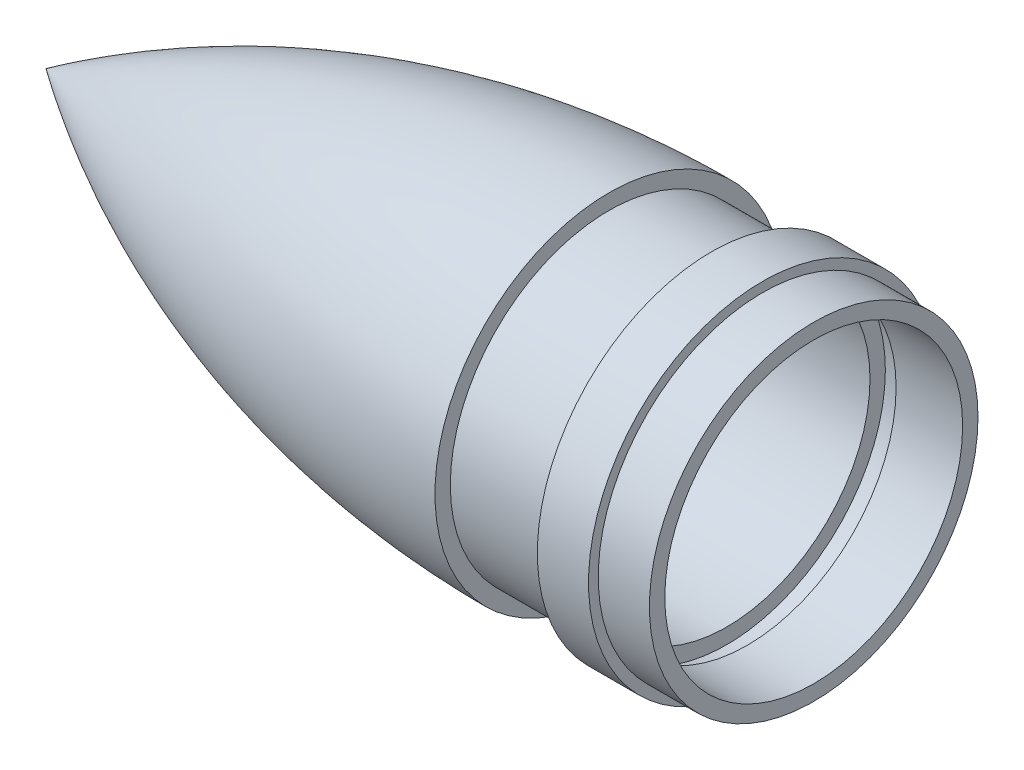
ISO-10303-21;
HEADER;
FILE_DESCRIPTION(('STEP AP214'),'2;1');
FILE_NAME('part.step','',(''),(''),'','','');
FILE_SCHEMA(('AUTOMOTIVE_DESIGN { 1 0 10303 214 1 1 1 1 }'));
ENDSEC;
DATA;
#1=APPLICATION_CONTEXT('core data for automotive mechanical design processes');
#2=APPLICATION_PROTOCOL_DEFINITION('international standard','automotive_design',2000,#1);
#3=PRODUCT_CONTEXT('',#1,'mechanical');
#4=PRODUCT('Part','Part','',(#3));
#5=PRODUCT_RELATED_PRODUCT_CATEGORY('part','',(#4));
#6=PRODUCT_DEFINITION_FORMATION('','',#4);
#7=PRODUCT_DEFINITION_CONTEXT('part definition',#1,'design');
#8=PRODUCT_DEFINITION('design','',#6,#7);
#9=PRODUCT_DEFINITION_SHAPE('','',#8);
#10=(LENGTH_UNIT() NAMED_UNIT(*) SI_UNIT(.MILLI.,.METRE.));
#11=(NAMED_UNIT(*) PLANE_ANGLE_UNIT() SI_UNIT($,.RADIAN.));
#12=(NAMED_UNIT(*) SI_UNIT($,.STERADIAN.) SOLID_ANGLE_UNIT());
#13=UNCERTAINTY_MEASURE_WITH_UNIT(LENGTH_MEASURE(1.E-05),#10,'distance_accuracy_value','');
#14=(GEOMETRIC_REPRESENTATION_CONTEXT(3) GLOBAL_UNCERTAINTY_ASSIGNED_CONTEXT((#13)) GLOBAL_UNIT_ASSIGNED_CONTEXT((#10,
#11,#12)) REPRESENTATION_CONTEXT('',''));
#15=CARTESIAN_POINT('',(0.,0.,0.));
#16=DIRECTION('',(0.,0.,1.));
#17=DIRECTION('',(1.,0.,0.));
#18=AXIS2_PLACEMENT_3D('',#15,#16,#17);
#19=CARTESIAN_POINT('',(0.,160.94,160.94));
#20=DIRECTION('',(0.,-1.,0.));
#21=DIRECTION('',(0.,0.,-1.));
#22=AXIS2_PLACEMENT_3D('',#19,#20,#21);
#23=CIRCLE('',#22,194.94);
#24=TRIMMED_CURVE('',#23,(PARAMETER_VALUE(-0.599554005573241)),
(PARAMETER_VALUE(0.599554005573241)),.T.,.PARAMETER.);
#25=CARTESIAN_POINT('',(0.,160.94,0.));
#26=DIRECTION('',(1.,0.,0.));
#27=AXIS1_PLACEMENT('',#25,#26);
#28=SURFACE_OF_REVOLUTION('',#24,#27);
#29=CARTESIAN_POINT('',(-109.999636363035,160.94,0.));
#30=VERTEX_POINT('',#29);
#31=VERTEX_LOOP('',#30);
#32=FACE_BOUND('',#31,.T.);
#33=CARTESIAN_POINT('',(0.,160.94,0.));
#34=DIRECTION('',(1.,0.,0.));
#35=DIRECTION('',(0.,0.,-1.));
#36=AXIS2_PLACEMENT_3D('',#33,#34,#35);
#37=CIRCLE('',#36,34.);
#38=CARTESIAN_POINT('',(0.,160.94,-34.));
#39=VERTEX_POINT('',#38);
#40=EDGE_CURVE('E41',#39,#39,#37,.T.);
#41=ORIENTED_EDGE('',*,*,#40,.F.);
#42=EDGE_LOOP('',(#41));
#43=FACE_BOUND('',#42,.T.);
#44=ADVANCED_FACE('F38',(#32,#43),#28,.T.);
#45=CARTESIAN_POINT('',(0.,194.94,0.));
#46=DIRECTION('',(1.,0.,0.));
#47=DIRECTION('',(0.,0.,-1.));
#48=AXIS2_PLACEMENT_3D('',#45,#46,#47);
#49=PLANE('',#48);
#50=CARTESIAN_POINT('',(0.,160.94,0.));
#51=DIRECTION('',(1.,0.,0.));
#52=DIRECTION('',(0.,0.,-1.));
#53=AXIS2_PLACEMENT_3D('',#50,#51,#52);
#54=CIRCLE('',#53,31.);
#55=CARTESIAN_POINT('',(0.,160.94,-31.));
#56=VERTEX_POINT('',#55);
#57=EDGE_CURVE('E89',#56,#56,#54,.T.);
#58=ORIENTED_EDGE('',*,*,#57,.F.);
#59=EDGE_LOOP('',(#58));
#60=FACE_BOUND('',#59,.T.);
#61=ORIENTED_EDGE('',*,*,#40,.T.);
#62=EDGE_LOOP('',(#61));
#63=FACE_BOUND('',#62,.T.);
#64=ADVANCED_FACE('F99',(#60,#63),#49,.T.);
#65=CARTESIAN_POINT('',(20.,160.94,0.));
#66=DIRECTION('',(-1.,0.,0.));
#67=DIRECTION('',(0.,0.,1.));
#68=AXIS2_PLACEMENT_3D('',#65,#66,#67);
#69=CYLINDRICAL_SURFACE('',#68,31.);
#70=CARTESIAN_POINT('',(20.,160.94,0.));
#71=DIRECTION('',(1.,0.,0.));
#72=DIRECTION('',(0.,0.,-1.));
#73=AXIS2_PLACEMENT_3D('',#70,#71,#72);
#74=CIRCLE('',#73,31.);
#75=CARTESIAN_POINT('',(20.,160.94,-31.));
#76=VERTEX_POINT('',#75);
#77=EDGE_CURVE('E92',#76,#76,#74,.T.);
#78=ORIENTED_EDGE('',*,*,#77,.F.);
#79=EDGE_LOOP('',(#78));
#80=FACE_BOUND('',#79,.T.);
#81=ORIENTED_EDGE('',*,*,#57,.T.);
#82=EDGE_LOOP('',(#81));
#83=FACE_BOUND('',#82,.T.);
#84=ADVANCED_FACE('F97',(#80,#83),#69,.T.);
#85=CARTESIAN_POINT('',(30.,160.94,0.));
#86=DIRECTION('',(-1.,0.,0.));
#87=DIRECTION('',(0.,0.,1.));
#88=AXIS2_PLACEMENT_3D('',#85,#86,#87);
#89=CYLINDRICAL_SURFACE('',#88,34.);
#90=CARTESIAN_POINT('',(30.,160.94,0.));
#91=DIRECTION('',(1.,0.,0.));
#92=DIRECTION('',(0.,0.,-1.));
#93=AXIS2_PLACEMENT_3D('',#90,#91,#92);
#94=CIRCLE('',#93,34.);
#95=CARTESIAN_POINT('',(30.,160.94,-34.));
#96=VERTEX_POINT('',#95);
#97=EDGE_CURVE('E86',#96,#96,#94,.T.);
#98=ORIENTED_EDGE('',*,*,#97,.F.);
#99=EDGE_LOOP('',(#98));
#100=FACE_BOUND('',#99,.T.);
#101=CARTESIAN_POINT('',(20.,160.94,0.));
#102=DIRECTION('',(1.,0.,0.));
#103=DIRECTION('',(0.,0.,-1.));
#104=AXIS2_PLACEMENT_3D('',#101,#102,#103);
#105=CIRCLE('',#104,34.);
#106=CARTESIAN_POINT('',(20.,160.94,-34.));
#107=VERTEX_POINT('',#106);
#108=EDGE_CURVE('E84',#107,#107,#105,.T.);
#109=ORIENTED_EDGE('',*,*,#108,.T.);
#110=EDGE_LOOP('',(#109));
#111=FACE_BOUND('',#110,.T.);
#112=ADVANCED_FACE('F118',(#100,#111),#89,.T.);
#113=CARTESIAN_POINT('',(30.,160.94,0.));
#114=DIRECTION('',(1.,0.,0.));
#115=DIRECTION('',(0.,0.,-1.));
#116=AXIS2_PLACEMENT_3D('',#113,#114,#115);
#117=PLANE('',#116);
#118=CARTESIAN_POINT('',(30.,160.94,0.));
#119=DIRECTION('',(1.,0.,0.));
#120=DIRECTION('',(0.,0.,-1.));
#121=AXIS2_PLACEMENT_3D('',#118,#119,#120);
#122=CIRCLE('',#121,32.1);
#123=CARTESIAN_POINT('',(30.,160.94,-32.1));
#124=VERTEX_POINT('',#123);
#125=EDGE_CURVE('E11',#124,#124,#122,.T.);
#126=ORIENTED_EDGE('',*,*,#125,.F.);
#127=EDGE_LOOP('',(#126));
#128=FACE_BOUND('',#127,.T.);
#129=ORIENTED_EDGE('',*,*,#97,.T.);
#130=EDGE_LOOP('',(#129));
#131=FACE_BOUND('',#130,.T.);
#132=ADVANCED_FACE('F126',(#128,#131),#117,.T.);
#133=CARTESIAN_POINT('',(20.,160.94,0.));
#134=DIRECTION('',(1.,0.,0.));
#135=DIRECTION('',(0.,0.,-1.));
#136=AXIS2_PLACEMENT_3D('',#133,#134,#135);
#137=PLANE('',#136);
#138=ORIENTED_EDGE('',*,*,#77,.T.);
#139=EDGE_LOOP('',(#138));
#140=FACE_BOUND('',#139,.T.);
#141=ORIENTED_EDGE('',*,*,#108,.F.);
#142=EDGE_LOOP('',(#141));
#143=FACE_BOUND('',#142,.T.);
#144=ADVANCED_FACE('F135',(#140,#143),#137,.F.);
#145=CARTESIAN_POINT('',(40.,160.94,0.));
#146=DIRECTION('',(-1.,0.,0.));
#147=DIRECTION('',(0.,0.,1.));
#148=AXIS2_PLACEMENT_3D('',#145,#146,#147);
#149=CYLINDRICAL_SURFACE('',#148,32.1);
#150=CARTESIAN_POINT('',(40.,160.94,0.));
#151=DIRECTION('',(1.,0.,0.));
#152=DIRECTION('',(0.,0.,-1.));
#153=AXIS2_PLACEMENT_3D('',#150,#151,#152);
#154=CIRCLE('',#153,32.1);
#155=CARTESIAN_POINT('',(40.,160.94,-32.1));
#156=VERTEX_POINT('',#155);
#157=EDGE_CURVE('E66',#156,#156,#154,.T.);
#158=ORIENTED_EDGE('',*,*,#157,.F.);
#159=EDGE_LOOP('',(#158));
#160=FACE_BOUND('',#159,.T.);
#161=ORIENTED_EDGE('',*,*,#125,.T.);
#162=EDGE_LOOP('',(#161));
#163=FACE_BOUND('',#162,.T.);
#164=ADVANCED_FACE('F143',(#160,#163),#149,.T.);
#165=CARTESIAN_POINT('',(40.,160.94,0.));
#166=DIRECTION('',(1.,0.,0.));
#167=DIRECTION('',(0.,0.,-1.));
#168=AXIS2_PLACEMENT_3D('',#165,#166,#167);
#169=PLANE('',#168);
#170=CARTESIAN_POINT('',(40.,160.94,0.));
#171=DIRECTION('',(1.,0.,0.));
#172=DIRECTION('',(0.,0.,-1.));
#173=AXIS2_PLACEMENT_3D('',#170,#171,#172);
#174=CIRCLE('',#173,29.1);
#175=CARTESIAN_POINT('',(40.,160.94,-29.1));
#176=VERTEX_POINT('',#175);
#177=EDGE_CURVE('E78',#176,#176,#174,.T.);
#178=ORIENTED_EDGE('',*,*,#177,.F.);
#179=EDGE_LOOP('',(#178));
#180=FACE_BOUND('',#179,.T.);
#181=ORIENTED_EDGE('',*,*,#157,.T.);
#182=EDGE_LOOP('',(#181));
#183=FACE_BOUND('',#182,.T.);
#184=ADVANCED_FACE('F56',(#180,#183),#169,.T.);
#185=CARTESIAN_POINT('',(0.,160.94,160.94));
#186=DIRECTION('',(0.,-1.,0.));
#187=DIRECTION('',(0.,0.,-1.));
#188=AXIS2_PLACEMENT_3D('',#185,#186,#187);
#189=CIRCLE('',#188,191.94);
#190=TRIMMED_CURVE('',#189,(PARAMETER_VALUE(-0.576287912192476)),
(PARAMETER_VALUE(0.576287912192476)),.T.,.PARAMETER.);
#191=CARTESIAN_POINT('',(0.,160.94,0.));
#192=DIRECTION('',(1.,0.,0.));
#193=AXIS1_PLACEMENT('',#191,#192);
#194=SURFACE_OF_REVOLUTION('',#190,#193);
#195=CARTESIAN_POINT('',(-104.59101299825,160.94,0.));
#196=VERTEX_POINT('',#195);
#197=VERTEX_LOOP('',#196);
#198=FACE_BOUND('',#197,.T.);
#199=CARTESIAN_POINT('',(-3.,160.94,0.));
#200=DIRECTION('',(1.,0.,0.));
#201=DIRECTION('',(0.,0.,-1.));
#202=AXIS2_PLACEMENT_3D('',#199,#200,#201);
#203=CIRCLE('',#202,30.9765537414634);
#204=CARTESIAN_POINT('',(-3.,160.94,-30.9765537414634));
#205=VERTEX_POINT('',#204);
#206=EDGE_CURVE('E60',#205,#205,#203,.T.);
#207=ORIENTED_EDGE('',*,*,#206,.T.);
#208=EDGE_LOOP('',(#207));
#209=FACE_BOUND('',#208,.T.);
#210=ADVANCED_FACE('F52',(#198,#209),#194,.F.);
#211=CARTESIAN_POINT('',(-3.,194.94,0.));
#212=DIRECTION('',(1.,0.,0.));
#213=DIRECTION('',(0.,0.,-1.));
#214=AXIS2_PLACEMENT_3D('',#211,#212,#213);
#215=PLANE('',#214);
#216=CARTESIAN_POINT('',(-3.,160.94,0.));
#217=DIRECTION('',(1.,0.,0.));
#218=DIRECTION('',(0.,0.,-1.));
#219=AXIS2_PLACEMENT_3D('',#216,#217,#218);
#220=CIRCLE('',#219,28.);
#221=CARTESIAN_POINT('',(-3.,160.94,-28.));
#222=VERTEX_POINT('',#221);
#223=EDGE_CURVE('E69',#222,#222,#220,.T.);
#224=ORIENTED_EDGE('',*,*,#223,.T.);
#225=EDGE_LOOP('',(#224));
#226=FACE_BOUND('',#225,.T.);
#227=ORIENTED_EDGE('',*,*,#206,.F.);
#228=EDGE_LOOP('',(#227));
#229=FACE_BOUND('',#228,.T.);
#230=ADVANCED_FACE('F55',(#226,#229),#215,.F.);
#231=CARTESIAN_POINT('',(20.,160.94,0.));
#232=DIRECTION('',(-1.,0.,0.));
#233=DIRECTION('',(0.,0.,1.));
#234=AXIS2_PLACEMENT_3D('',#231,#232,#233);
#235=CYLINDRICAL_SURFACE('',#234,28.);
#236=CARTESIAN_POINT('',(23.,160.94,0.));
#237=DIRECTION('',(1.,0.,0.));
#238=DIRECTION('',(0.,0.,-1.));
#239=AXIS2_PLACEMENT_3D('',#236,#237,#238);
#240=CIRCLE('',#239,28.);
#241=CARTESIAN_POINT('',(23.,160.94,-28.));
#242=VERTEX_POINT('',#241);
#243=EDGE_CURVE('E63',#242,#242,#240,.T.);
#244=ORIENTED_EDGE('',*,*,#243,.T.);
#245=EDGE_LOOP('',(#244));
#246=FACE_BOUND('',#245,.T.);
#247=ORIENTED_EDGE('',*,*,#223,.F.);
#248=EDGE_LOOP('',(#247));
#249=FACE_BOUND('',#248,.T.);
#250=ADVANCED_FACE('F168',(#246,#249),#235,.F.);
#251=CARTESIAN_POINT('',(30.,160.94,0.));
#252=DIRECTION('',(-1.,0.,0.));
#253=DIRECTION('',(0.,0.,1.));
#254=AXIS2_PLACEMENT_3D('',#251,#252,#253);
#255=CYLINDRICAL_SURFACE('',#254,31.);
#256=CARTESIAN_POINT('',(27.,160.94,0.));
#257=DIRECTION('',(1.,0.,0.));
#258=DIRECTION('',(0.,0.,-1.));
#259=AXIS2_PLACEMENT_3D('',#256,#257,#258);
#260=CIRCLE('',#259,31.);
#261=CARTESIAN_POINT('',(27.,160.94,-31.));
#262=VERTEX_POINT('',#261);
#263=EDGE_CURVE('E73',#262,#262,#260,.T.);
#264=ORIENTED_EDGE('',*,*,#263,.T.);
#265=EDGE_LOOP('',(#264));
#266=FACE_BOUND('',#265,.T.);
#267=CARTESIAN_POINT('',(23.,160.94,0.));
#268=DIRECTION('',(1.,0.,0.));
#269=DIRECTION('',(0.,0.,-1.));
#270=AXIS2_PLACEMENT_3D('',#267,#268,#269);
#271=CIRCLE('',#270,31.);
#272=CARTESIAN_POINT('',(23.,160.94,-31.));
#273=VERTEX_POINT('',#272);
#274=EDGE_CURVE('E75',#273,#273,#271,.T.);
#275=ORIENTED_EDGE('',*,*,#274,.F.);
#276=EDGE_LOOP('',(#275));
#277=FACE_BOUND('',#276,.T.);
#278=ADVANCED_FACE('F176',(#266,#277),#255,.F.);
#279=CARTESIAN_POINT('',(27.,160.94,0.));
#280=DIRECTION('',(1.,0.,0.));
#281=DIRECTION('',(0.,0.,-1.));
#282=AXIS2_PLACEMENT_3D('',#279,#280,#281);
#283=PLANE('',#282);
#284=CARTESIAN_POINT('',(27.,160.94,0.));
#285=DIRECTION('',(1.,0.,0.));
#286=DIRECTION('',(0.,0.,-1.));
#287=AXIS2_PLACEMENT_3D('',#284,#285,#286);
#288=CIRCLE('',#287,29.1);
#289=CARTESIAN_POINT('',(27.,160.94,-29.1));
#290=VERTEX_POINT('',#289);
#291=EDGE_CURVE('E62',#290,#290,#288,.T.);
#292=ORIENTED_EDGE('',*,*,#291,.T.);
#293=EDGE_LOOP('',(#292));
#294=FACE_BOUND('',#293,.T.);
#295=ORIENTED_EDGE('',*,*,#263,.F.);
#296=EDGE_LOOP('',(#295));
#297=FACE_BOUND('',#296,.T.);
#298=ADVANCED_FACE('F184',(#294,#297),#283,.F.);
#299=CARTESIAN_POINT('',(23.,160.94,0.));
#300=DIRECTION('',(1.,0.,0.));
#301=DIRECTION('',(0.,0.,-1.));
#302=AXIS2_PLACEMENT_3D('',#299,#300,#301);
#303=PLANE('',#302);
#304=ORIENTED_EDGE('',*,*,#243,.F.);
#305=EDGE_LOOP('',(#304));
#306=FACE_BOUND('',#305,.T.);
#307=ORIENTED_EDGE('',*,*,#274,.T.);
#308=EDGE_LOOP('',(#307));
#309=FACE_BOUND('',#308,.T.);
#310=ADVANCED_FACE('F192',(#306,#309),#303,.T.);
#311=CARTESIAN_POINT('',(40.,160.94,0.));
#312=DIRECTION('',(-1.,0.,0.));
#313=DIRECTION('',(0.,0.,1.));
#314=AXIS2_PLACEMENT_3D('',#311,#312,#313);
#315=CYLINDRICAL_SURFACE('',#314,29.1);
#316=ORIENTED_EDGE('',*,*,#177,.T.);
#317=EDGE_LOOP('',(#316));
#318=FACE_BOUND('',#317,.T.);
#319=ORIENTED_EDGE('',*,*,#291,.F.);
#320=EDGE_LOOP('',(#319));
#321=FACE_BOUND('',#320,.T.);
#322=ADVANCED_FACE('F200',(#318,#321),#315,.F.);
#323=CLOSED_SHELL('',(#44,#64,#84,#112,#132,#144,#164,#184,#210,#230,#250,#278,#298,#310,#322));
#324=MANIFOLD_SOLID_BREP('B2',#323);
#325=ADVANCED_BREP_SHAPE_REPRESENTATION('',(#18,#324),#14);
#326=SHAPE_DEFINITION_REPRESENTATION(#9,#325);
ENDSEC;
END-ISO-10303-21;
